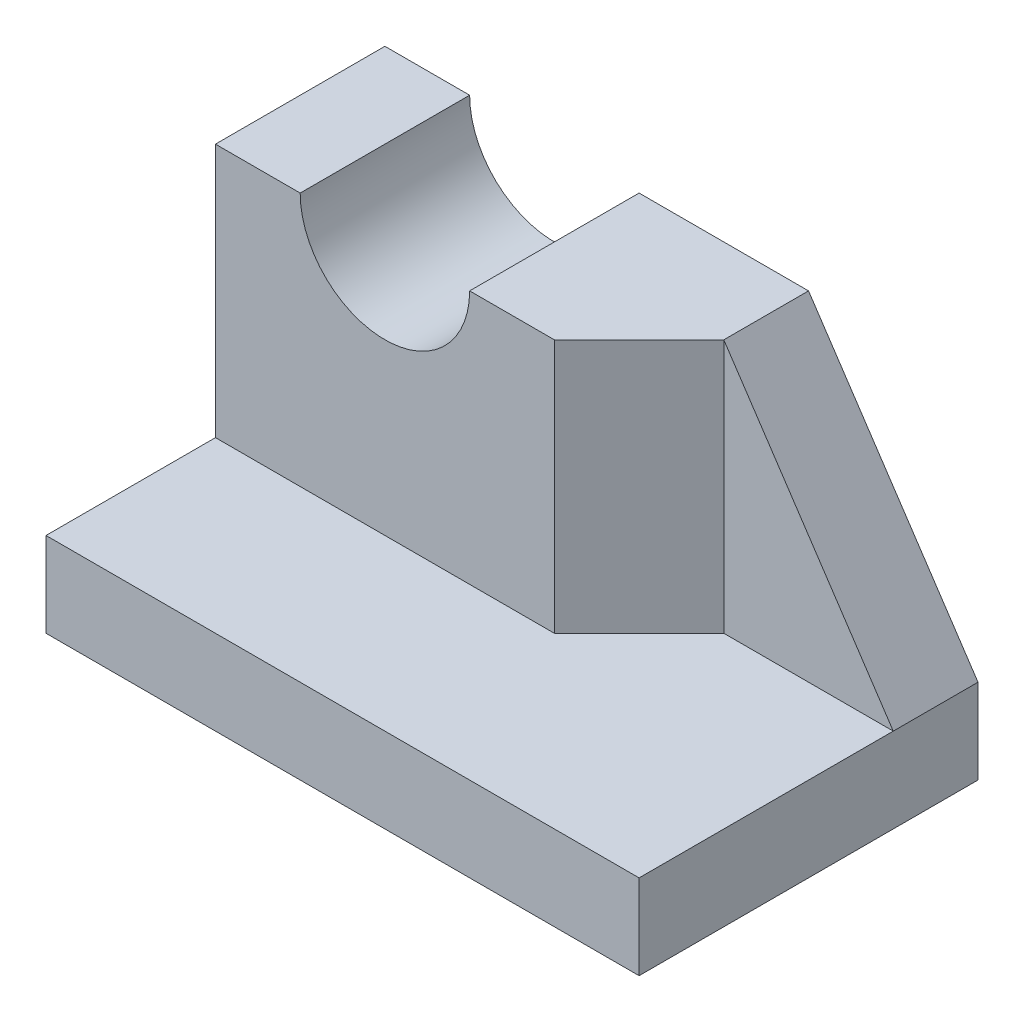
ISO-10303-21;
HEADER;
FILE_DESCRIPTION(('STEP AP214'),'2;1');
FILE_NAME('part.step','',(''),(''),'','','');
FILE_SCHEMA(('AUTOMOTIVE_DESIGN { 1 0 10303 214 1 1 1 1 }'));
ENDSEC;
DATA;
#1=APPLICATION_CONTEXT('core data for automotive mechanical design processes');
#2=APPLICATION_PROTOCOL_DEFINITION('international standard','automotive_design',2000,#1);
#3=PRODUCT_CONTEXT('',#1,'mechanical');
#4=PRODUCT('Part','Part','',(#3));
#5=PRODUCT_RELATED_PRODUCT_CATEGORY('part','',(#4));
#6=PRODUCT_DEFINITION_FORMATION('','',#4);
#7=PRODUCT_DEFINITION_CONTEXT('part definition',#1,'design');
#8=PRODUCT_DEFINITION('design','',#6,#7);
#9=PRODUCT_DEFINITION_SHAPE('','',#8);
#10=(LENGTH_UNIT() NAMED_UNIT(*) SI_UNIT(.MILLI.,.METRE.));
#11=(NAMED_UNIT(*) PLANE_ANGLE_UNIT() SI_UNIT($,.RADIAN.));
#12=(NAMED_UNIT(*) SI_UNIT($,.STERADIAN.) SOLID_ANGLE_UNIT());
#13=UNCERTAINTY_MEASURE_WITH_UNIT(LENGTH_MEASURE(1.E-05),#10,'distance_accuracy_value','');
#14=(GEOMETRIC_REPRESENTATION_CONTEXT(3) GLOBAL_UNCERTAINTY_ASSIGNED_CONTEXT((#13)) GLOBAL_UNIT_ASSIGNED_CONTEXT((#10,
#11,#12)) REPRESENTATION_CONTEXT('',''));
#15=CARTESIAN_POINT('',(0.,0.,0.));
#16=DIRECTION('',(0.,0.,1.));
#17=DIRECTION('',(1.,0.,0.));
#18=AXIS2_PLACEMENT_3D('',#15,#16,#17);
#19=CARTESIAN_POINT('',(0.,20.,20.));
#20=DIRECTION('',(0.,-1.,0.));
#21=DIRECTION('',(0.,0.,-1.));
#22=AXIS2_PLACEMENT_3D('',#19,#20,#21);
#23=PLANE('',#22);
#24=DIRECTION('',(-1.,0.,0.));
#25=VECTOR('',#24,1.);
#26=CARTESIAN_POINT('',(0.,20.,0.));
#27=LINE('',#26,#25);
#28=CARTESIAN_POINT('',(25.,20.,0.));
#29=VERTEX_POINT('',#28);
#30=CARTESIAN_POINT('',(15.,20.,0.));
#31=VERTEX_POINT('',#30);
#32=EDGE_CURVE('E124',#29,#31,#27,.T.);
#33=ORIENTED_EDGE('',*,*,#32,.T.);
#34=DIRECTION('',(0.,0.,1.));
#35=VECTOR('',#34,1.);
#36=CARTESIAN_POINT('',(15.,20.,0.));
#37=LINE('',#36,#35);
#38=CARTESIAN_POINT('',(15.,20.,10.));
#39=VERTEX_POINT('',#38);
#40=EDGE_CURVE('E109',#31,#39,#37,.T.);
#41=ORIENTED_EDGE('',*,*,#40,.T.);
#42=DIRECTION('',(-1.,0.,0.));
#43=VECTOR('',#42,1.);
#44=CARTESIAN_POINT('',(0.,20.,10.));
#45=LINE('',#44,#43);
#46=CARTESIAN_POINT('',(20.,20.,10.));
#47=VERTEX_POINT('',#46);
#48=EDGE_CURVE('E157',#47,#39,#45,.T.);
#49=ORIENTED_EDGE('',*,*,#48,.F.);
#50=DIRECTION('',(-0.707106781186548,0.,0.707106781186547));
#51=VECTOR('',#50,1.);
#52=CARTESIAN_POINT('',(4.99999999999999,20.,25.));
#53=LINE('',#52,#51);
#54=CARTESIAN_POINT('',(25.,20.,5.));
#55=VERTEX_POINT('',#54);
#56=EDGE_CURVE('E154',#55,#47,#53,.T.);
#57=ORIENTED_EDGE('',*,*,#56,.F.);
#58=DIRECTION('',(0.,0.,-1.));
#59=VECTOR('',#58,1.);
#60=CARTESIAN_POINT('',(25.,20.,20.));
#61=LINE('',#60,#59);
#62=EDGE_CURVE('E130',#55,#29,#61,.T.);
#63=ORIENTED_EDGE('',*,*,#62,.T.);
#64=EDGE_LOOP('',(#33,#41,#49,#57,#63));
#65=FACE_BOUND('',#64,.T.);
#66=ADVANCED_FACE('F34',(#65),#23,.F.);
#67=CARTESIAN_POINT('',(25.,20.,20.));
#68=DIRECTION('',(-0.832050294337844,-0.554700196225229,0.));
#69=DIRECTION('',(0.554700196225229,-0.832050294337844,0.));
#70=AXIS2_PLACEMENT_3D('',#67,#68,#69);
#71=PLANE('',#70);
#72=DIRECTION('',(-0.554700196225229,0.832050294337844,0.));
#73=VECTOR('',#72,1.);
#74=CARTESIAN_POINT('',(25.,20.,5.));
#75=LINE('',#74,#73);
#76=CARTESIAN_POINT('',(35.,5.,5.));
#77=VERTEX_POINT('',#76);
#78=EDGE_CURVE('E42',#77,#55,#75,.T.);
#79=ORIENTED_EDGE('',*,*,#78,.F.);
#80=DIRECTION('',(0.,0.,-1.));
#81=VECTOR('',#80,1.);
#82=CARTESIAN_POINT('',(35.,5.,20.));
#83=LINE('',#82,#81);
#84=CARTESIAN_POINT('',(35.,5.,0.));
#85=VERTEX_POINT('',#84);
#86=EDGE_CURVE('E145',#77,#85,#83,.T.);
#87=ORIENTED_EDGE('',*,*,#86,.T.);
#88=DIRECTION('',(-0.554700196225229,0.832050294337843,0.));
#89=VECTOR('',#88,1.);
#90=CARTESIAN_POINT('',(25.,20.,0.));
#91=LINE('',#90,#89);
#92=EDGE_CURVE('E136',#85,#29,#91,.T.);
#93=ORIENTED_EDGE('',*,*,#92,.T.);
#94=ORIENTED_EDGE('',*,*,#62,.F.);
#95=EDGE_LOOP('',(#79,#87,#93,#94));
#96=FACE_BOUND('',#95,.T.);
#97=ADVANCED_FACE('F176',(#96),#71,.F.);
#98=CARTESIAN_POINT('',(5.,20.,10.));
#99=VERTEX_POINT('',#98);
#100=CARTESIAN_POINT('',(0.,20.,10.));
#101=VERTEX_POINT('',#100);
#102=EDGE_CURVE('E156',#99,#101,#45,.T.);
#103=ORIENTED_EDGE('',*,*,#102,.F.);
#104=DIRECTION('',(0.,0.,1.));
#105=VECTOR('',#104,1.);
#106=CARTESIAN_POINT('',(5.,20.,0.));
#107=LINE('',#106,#105);
#108=CARTESIAN_POINT('',(5.,20.,0.));
#109=VERTEX_POINT('',#108);
#110=EDGE_CURVE('E48',#99,#109,#107,.F.);
#111=ORIENTED_EDGE('',*,*,#110,.T.);
#112=CARTESIAN_POINT('',(0.,20.,0.));
#113=VERTEX_POINT('',#112);
#114=EDGE_CURVE('E126',#109,#113,#27,.T.);
#115=ORIENTED_EDGE('',*,*,#114,.T.);
#116=DIRECTION('',(0.,0.,-1.));
#117=VECTOR('',#116,1.);
#118=CARTESIAN_POINT('',(0.,20.,20.));
#119=LINE('',#118,#117);
#120=EDGE_CURVE('E140',#101,#113,#119,.T.);
#121=ORIENTED_EDGE('',*,*,#120,.F.);
#122=EDGE_LOOP('',(#103,#111,#115,#121));
#123=FACE_BOUND('',#122,.T.);
#124=ADVANCED_FACE('F200',(#123),#23,.F.);
#125=CARTESIAN_POINT('',(0.,0.,20.));
#126=DIRECTION('',(1.,0.,0.));
#127=DIRECTION('',(0.,0.,-1.));
#128=AXIS2_PLACEMENT_3D('',#125,#126,#127);
#129=PLANE('',#128);
#130=DIRECTION('',(0.,-1.,0.));
#131=VECTOR('',#130,1.);
#132=CARTESIAN_POINT('',(0.,0.,20.));
#133=LINE('',#132,#131);
#134=CARTESIAN_POINT('',(0.,5.,20.));
#135=VERTEX_POINT('',#134);
#136=CARTESIAN_POINT('',(0.,0.,20.));
#137=VERTEX_POINT('',#136);
#138=EDGE_CURVE('E132',#135,#137,#133,.T.);
#139=ORIENTED_EDGE('',*,*,#138,.F.);
#140=DIRECTION('',(0.,0.,-1.));
#141=VECTOR('',#140,1.);
#142=CARTESIAN_POINT('',(0.,5.,20.));
#143=LINE('',#142,#141);
#144=CARTESIAN_POINT('',(0.,5.,10.));
#145=VERTEX_POINT('',#144);
#146=EDGE_CURVE('E56',#135,#145,#143,.T.);
#147=ORIENTED_EDGE('',*,*,#146,.T.);
#148=DIRECTION('',(0.,-1.,0.));
#149=VECTOR('',#148,1.);
#150=CARTESIAN_POINT('',(0.,25.,10.));
#151=LINE('',#150,#149);
#152=EDGE_CURVE('E191',#101,#145,#151,.T.);
#153=ORIENTED_EDGE('',*,*,#152,.F.);
#154=ORIENTED_EDGE('',*,*,#120,.T.);
#155=DIRECTION('',(0.,-1.,0.));
#156=VECTOR('',#155,1.);
#157=CARTESIAN_POINT('',(0.,0.,0.));
#158=LINE('',#157,#156);
#159=CARTESIAN_POINT('',(0.,0.,0.));
#160=VERTEX_POINT('',#159);
#161=EDGE_CURVE('E182',#113,#160,#158,.T.);
#162=ORIENTED_EDGE('',*,*,#161,.T.);
#163=DIRECTION('',(0.,0.,-1.));
#164=VECTOR('',#163,1.);
#165=CARTESIAN_POINT('',(0.,0.,20.));
#166=LINE('',#165,#164);
#167=EDGE_CURVE('E151',#137,#160,#166,.T.);
#168=ORIENTED_EDGE('',*,*,#167,.F.);
#169=EDGE_LOOP('',(#139,#147,#153,#154,#162,#168));
#170=FACE_BOUND('',#169,.T.);
#171=ADVANCED_FACE('F36',(#170),#129,.F.);
#172=CARTESIAN_POINT('',(0.,0.,20.));
#173=DIRECTION('',(0.,1.,0.));
#174=DIRECTION('',(0.,0.,1.));
#175=AXIS2_PLACEMENT_3D('',#172,#173,#174);
#176=PLANE('',#175);
#177=DIRECTION('',(1.,0.,0.));
#178=VECTOR('',#177,1.);
#179=CARTESIAN_POINT('',(0.,0.,0.));
#180=LINE('',#179,#178);
#181=CARTESIAN_POINT('',(35.,0.,0.));
#182=VERTEX_POINT('',#181);
#183=EDGE_CURVE('E180',#160,#182,#180,.T.);
#184=ORIENTED_EDGE('',*,*,#183,.T.);
#185=DIRECTION('',(0.,0.,-1.));
#186=VECTOR('',#185,1.);
#187=CARTESIAN_POINT('',(35.,0.,20.));
#188=LINE('',#187,#186);
#189=CARTESIAN_POINT('',(35.,0.,20.));
#190=VERTEX_POINT('',#189);
#191=EDGE_CURVE('E148',#190,#182,#188,.T.);
#192=ORIENTED_EDGE('',*,*,#191,.F.);
#193=DIRECTION('',(1.,0.,0.));
#194=VECTOR('',#193,1.);
#195=CARTESIAN_POINT('',(0.,0.,20.));
#196=LINE('',#195,#194);
#197=EDGE_CURVE('E134',#137,#190,#196,.T.);
#198=ORIENTED_EDGE('',*,*,#197,.F.);
#199=ORIENTED_EDGE('',*,*,#167,.T.);
#200=EDGE_LOOP('',(#184,#192,#198,#199));
#201=FACE_BOUND('',#200,.T.);
#202=ADVANCED_FACE('F214',(#201),#176,.F.);
#203=CARTESIAN_POINT('',(35.,0.,20.));
#204=DIRECTION('',(-1.,0.,0.));
#205=DIRECTION('',(0.,0.,1.));
#206=AXIS2_PLACEMENT_3D('',#203,#204,#205);
#207=PLANE('',#206);
#208=DIRECTION('',(0.,1.,0.));
#209=VECTOR('',#208,1.);
#210=CARTESIAN_POINT('',(35.,0.,0.));
#211=LINE('',#210,#209);
#212=EDGE_CURVE('E179',#182,#85,#211,.T.);
#213=ORIENTED_EDGE('',*,*,#212,.T.);
#214=ORIENTED_EDGE('',*,*,#86,.F.);
#215=CARTESIAN_POINT('',(35.,5.,20.));
#216=VERTEX_POINT('',#215);
#217=EDGE_CURVE('E146',#216,#77,#83,.T.);
#218=ORIENTED_EDGE('',*,*,#217,.F.);
#219=DIRECTION('',(0.,1.,0.));
#220=VECTOR('',#219,1.);
#221=CARTESIAN_POINT('',(35.,0.,20.));
#222=LINE('',#221,#220);
#223=EDGE_CURVE('E143',#190,#216,#222,.T.);
#224=ORIENTED_EDGE('',*,*,#223,.F.);
#225=ORIENTED_EDGE('',*,*,#191,.T.);
#226=EDGE_LOOP('',(#213,#214,#218,#224,#225));
#227=FACE_BOUND('',#226,.T.);
#228=ADVANCED_FACE('F218',(#227),#207,.F.);
#229=CARTESIAN_POINT('',(0.,0.,20.));
#230=DIRECTION('',(0.,0.,-1.));
#231=DIRECTION('',(-1.,0.,0.));
#232=AXIS2_PLACEMENT_3D('',#229,#230,#231);
#233=PLANE('',#232);
#234=ORIENTED_EDGE('',*,*,#223,.T.);
#235=DIRECTION('',(-1.,0.,0.));
#236=VECTOR('',#235,1.);
#237=CARTESIAN_POINT('',(0.,5.,20.));
#238=LINE('',#237,#236);
#239=EDGE_CURVE('E190',#216,#135,#238,.T.);
#240=ORIENTED_EDGE('',*,*,#239,.T.);
#241=ORIENTED_EDGE('',*,*,#138,.T.);
#242=ORIENTED_EDGE('',*,*,#197,.T.);
#243=EDGE_LOOP('',(#234,#240,#241,#242));
#244=FACE_BOUND('',#243,.T.);
#245=ADVANCED_FACE('F211',(#244),#233,.F.);
#246=CARTESIAN_POINT('',(0.,0.,0.));
#247=DIRECTION('',(0.,0.,-1.));
#248=DIRECTION('',(-1.,0.,0.));
#249=AXIS2_PLACEMENT_3D('',#246,#247,#248);
#250=PLANE('',#249);
#251=CARTESIAN_POINT('',(10.,20.,0.));
#252=DIRECTION('',(0.,0.,1.));
#253=DIRECTION('',(1.,0.,0.));
#254=AXIS2_PLACEMENT_3D('',#251,#252,#253);
#255=CIRCLE('',#254,5.);
#256=EDGE_CURVE('E112',#109,#31,#255,.T.);
#257=ORIENTED_EDGE('',*,*,#256,.T.);
#258=ORIENTED_EDGE('',*,*,#32,.F.);
#259=ORIENTED_EDGE('',*,*,#92,.F.);
#260=ORIENTED_EDGE('',*,*,#212,.F.);
#261=ORIENTED_EDGE('',*,*,#183,.F.);
#262=ORIENTED_EDGE('',*,*,#161,.F.);
#263=ORIENTED_EDGE('',*,*,#114,.F.);
#264=EDGE_LOOP('',(#257,#258,#259,#260,#261,#262,#263));
#265=FACE_BOUND('',#264,.T.);
#266=ADVANCED_FACE('F122',(#265),#250,.T.);
#267=CARTESIAN_POINT('',(35.,25.,5.));
#268=DIRECTION('',(0.,0.,1.));
#269=DIRECTION('',(1.,0.,0.));
#270=AXIS2_PLACEMENT_3D('',#267,#268,#269);
#271=PLANE('',#270);
#272=ORIENTED_EDGE('',*,*,#78,.T.);
#273=DIRECTION('',(0.,-1.,0.));
#274=VECTOR('',#273,1.);
#275=CARTESIAN_POINT('',(25.,25.,5.));
#276=LINE('',#275,#274);
#277=CARTESIAN_POINT('',(25.,5.,5.));
#278=VERTEX_POINT('',#277);
#279=EDGE_CURVE('E163',#55,#278,#276,.T.);
#280=ORIENTED_EDGE('',*,*,#279,.T.);
#281=DIRECTION('',(-1.,0.,0.));
#282=VECTOR('',#281,1.);
#283=CARTESIAN_POINT('',(35.,5.,5.));
#284=LINE('',#283,#282);
#285=EDGE_CURVE('E117',#77,#278,#284,.T.);
#286=ORIENTED_EDGE('',*,*,#285,.F.);
#287=EDGE_LOOP('',(#272,#280,#286));
#288=FACE_BOUND('',#287,.T.);
#289=ADVANCED_FACE('F162',(#288),#271,.T.);
#290=CARTESIAN_POINT('',(20.,25.,10.));
#291=DIRECTION('',(0.,0.,1.));
#292=DIRECTION('',(1.,0.,0.));
#293=AXIS2_PLACEMENT_3D('',#290,#291,#292);
#294=PLANE('',#293);
#295=CARTESIAN_POINT('',(10.,20.,10.));
#296=DIRECTION('',(0.,0.,1.));
#297=DIRECTION('',(1.,0.,0.));
#298=AXIS2_PLACEMENT_3D('',#295,#296,#297);
#299=CIRCLE('',#298,5.);
#300=EDGE_CURVE('E12',#99,#39,#299,.T.);
#301=ORIENTED_EDGE('',*,*,#300,.F.);
#302=ORIENTED_EDGE('',*,*,#102,.T.);
#303=ORIENTED_EDGE('',*,*,#152,.T.);
#304=DIRECTION('',(-1.,0.,0.));
#305=VECTOR('',#304,1.);
#306=CARTESIAN_POINT('',(20.,5.,10.));
#307=LINE('',#306,#305);
#308=CARTESIAN_POINT('',(20.,5.,10.));
#309=VERTEX_POINT('',#308);
#310=EDGE_CURVE('E174',#309,#145,#307,.T.);
#311=ORIENTED_EDGE('',*,*,#310,.F.);
#312=DIRECTION('',(0.,-1.,0.));
#313=VECTOR('',#312,1.);
#314=CARTESIAN_POINT('',(20.,25.,10.));
#315=LINE('',#314,#313);
#316=EDGE_CURVE('E173',#47,#309,#315,.T.);
#317=ORIENTED_EDGE('',*,*,#316,.F.);
#318=ORIENTED_EDGE('',*,*,#48,.T.);
#319=EDGE_LOOP('',(#301,#302,#303,#311,#317,#318));
#320=FACE_BOUND('',#319,.T.);
#321=ADVANCED_FACE('F204',(#320),#294,.T.);
#322=CARTESIAN_POINT('',(25.,25.,5.));
#323=DIRECTION('',(0.707106781186547,0.,0.707106781186548));
#324=DIRECTION('',(0.707106781186548,0.,-0.707106781186547));
#325=AXIS2_PLACEMENT_3D('',#322,#323,#324);
#326=PLANE('',#325);
#327=ORIENTED_EDGE('',*,*,#56,.T.);
#328=ORIENTED_EDGE('',*,*,#316,.T.);
#329=DIRECTION('',(-0.707106781186548,0.,0.707106781186547));
#330=VECTOR('',#329,1.);
#331=CARTESIAN_POINT('',(25.,5.,5.));
#332=LINE('',#331,#330);
#333=EDGE_CURVE('E172',#278,#309,#332,.T.);
#334=ORIENTED_EDGE('',*,*,#333,.F.);
#335=ORIENTED_EDGE('',*,*,#279,.F.);
#336=EDGE_LOOP('',(#327,#328,#334,#335));
#337=FACE_BOUND('',#336,.T.);
#338=ADVANCED_FACE('F169',(#337),#326,.T.);
#339=CARTESIAN_POINT('',(17.5,5.,10.));
#340=DIRECTION('',(0.,-1.,0.));
#341=DIRECTION('',(0.,0.,-1.));
#342=AXIS2_PLACEMENT_3D('',#339,#340,#341);
#343=PLANE('',#342);
#344=ORIENTED_EDGE('',*,*,#239,.F.);
#345=ORIENTED_EDGE('',*,*,#217,.T.);
#346=ORIENTED_EDGE('',*,*,#285,.T.);
#347=ORIENTED_EDGE('',*,*,#333,.T.);
#348=ORIENTED_EDGE('',*,*,#310,.T.);
#349=ORIENTED_EDGE('',*,*,#146,.F.);
#350=EDGE_LOOP('',(#344,#345,#346,#347,#348,#349));
#351=FACE_BOUND('',#350,.T.);
#352=ADVANCED_FACE('F219',(#351),#343,.F.);
#353=CARTESIAN_POINT('',(10.,20.,0.));
#354=DIRECTION('',(0.,0.,1.));
#355=DIRECTION('',(1.,0.,0.));
#356=AXIS2_PLACEMENT_3D('',#353,#354,#355);
#357=CYLINDRICAL_SURFACE('',#356,5.);
#358=ORIENTED_EDGE('',*,*,#256,.F.);
#359=ORIENTED_EDGE('',*,*,#110,.F.);
#360=ORIENTED_EDGE('',*,*,#300,.T.);
#361=ORIENTED_EDGE('',*,*,#40,.F.);
#362=EDGE_LOOP('',(#358,#359,#360,#361));
#363=FACE_BOUND('',#362,.T.);
#364=ADVANCED_FACE('F111',(#363),#357,.F.);
#365=CLOSED_SHELL('',(#66,#97,#124,#171,#202,#228,#245,#266,#289,#321,#338,#352,#364));
#366=MANIFOLD_SOLID_BREP('B2',#365);
#367=ADVANCED_BREP_SHAPE_REPRESENTATION('',(#18,#366),#14);
#368=SHAPE_DEFINITION_REPRESENTATION(#9,#367);
ENDSEC;
END-ISO-10303-21;
